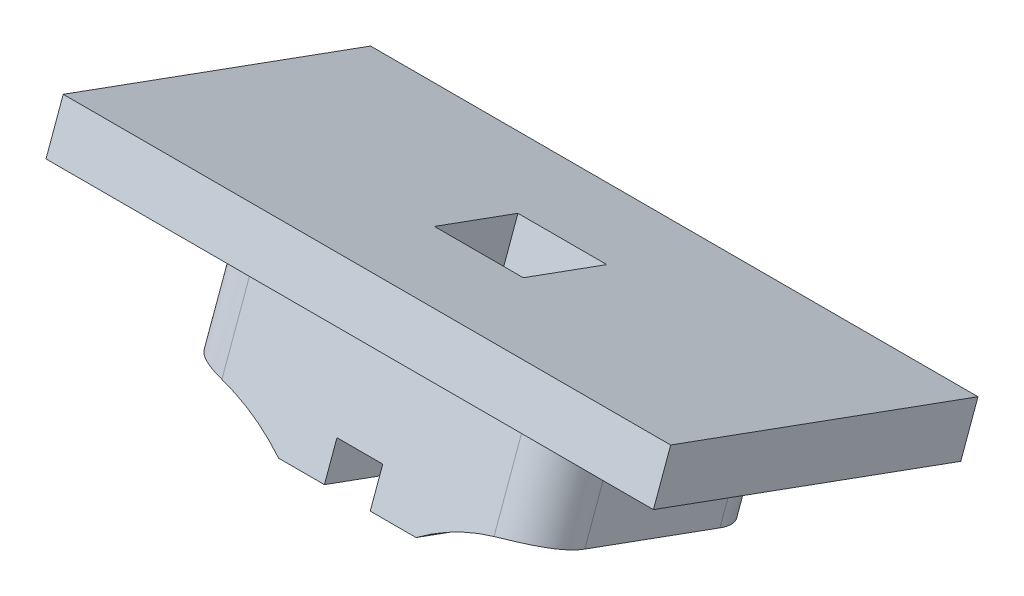
ISO-10303-21;
HEADER;
FILE_DESCRIPTION(('STEP AP214'),'2;1');
FILE_NAME('part.step','',(''),(''),'','','');
FILE_SCHEMA(('AUTOMOTIVE_DESIGN { 1 0 10303 214 1 1 1 1 }'));
ENDSEC;
DATA;
#1=APPLICATION_CONTEXT('core data for automotive mechanical design processes');
#2=APPLICATION_PROTOCOL_DEFINITION('international standard','automotive_design',2000,#1);
#3=PRODUCT_CONTEXT('',#1,'mechanical');
#4=PRODUCT('Part','Part','',(#3));
#5=PRODUCT_RELATED_PRODUCT_CATEGORY('part','',(#4));
#6=PRODUCT_DEFINITION_FORMATION('','',#4);
#7=PRODUCT_DEFINITION_CONTEXT('part definition',#1,'design');
#8=PRODUCT_DEFINITION('design','',#6,#7);
#9=PRODUCT_DEFINITION_SHAPE('','',#8);
#10=(LENGTH_UNIT() NAMED_UNIT(*) SI_UNIT(.MILLI.,.METRE.));
#11=(NAMED_UNIT(*) PLANE_ANGLE_UNIT() SI_UNIT($,.RADIAN.));
#12=(NAMED_UNIT(*) SI_UNIT($,.STERADIAN.) SOLID_ANGLE_UNIT());
#13=UNCERTAINTY_MEASURE_WITH_UNIT(LENGTH_MEASURE(1.E-05),#10,'distance_accuracy_value','');
#14=(GEOMETRIC_REPRESENTATION_CONTEXT(3) GLOBAL_UNCERTAINTY_ASSIGNED_CONTEXT((#13)) GLOBAL_UNIT_ASSIGNED_CONTEXT((#10,
#11,#12)) REPRESENTATION_CONTEXT('',''));
#15=CARTESIAN_POINT('',(0.,0.,0.));
#16=DIRECTION('',(0.,0.,1.));
#17=DIRECTION('',(1.,0.,0.));
#18=AXIS2_PLACEMENT_3D('',#15,#16,#17);
#19=CARTESIAN_POINT('',(-3.95,-154.797534153844,42.6878754649024));
#20=DIRECTION('',(0.,-0.34202014332567,-0.939692620785908));
#21=DIRECTION('',(0.,0.939692620785908,-0.34202014332567));
#22=AXIS2_PLACEMENT_3D('',#19,#20,#21);
#23=PLANE('',#22);
#24=CARTESIAN_POINT('',(2.98999999999996,-147.707143319751,40.1071842519784));
#25=DIRECTION('',(0.,-0.34202014332567,-0.939692620785908));
#26=DIRECTION('',(0.,0.939692620785908,-0.34202014332567));
#27=AXIS2_PLACEMENT_3D('',#24,#25,#26);
#28=CIRCLE('',#27,4.21306249999999);
#29=CARTESIAN_POINT('',(1.98999999999998,-143.861297502622,38.7074108489664));
#30=VERTEX_POINT('',#29);
#31=CARTESIAN_POINT('',(0.520000000000027,-144.49991367422,38.939848126549));
#32=VERTEX_POINT('',#31);
#33=EDGE_CURVE('E63',#30,#32,#28,.F.);
#34=ORIENTED_EDGE('',*,*,#33,.F.);
#35=DIRECTION('',(0.,0.939692620785908,-0.34202014332567));
#36=VECTOR('',#35,1.);
#37=CARTESIAN_POINT('',(1.98999999999998,-154.797534153844,42.6878754649024));
#38=LINE('',#37,#36);
#39=CARTESIAN_POINT('',(1.98999999999999,-141.774805073941,37.9479897109045));
#40=VERTEX_POINT('',#39);
#41=EDGE_CURVE('E368',#30,#40,#38,.T.);
#42=ORIENTED_EDGE('',*,*,#41,.T.);
#43=DIRECTION('',(-1.,0.,0.));
#44=VECTOR('',#43,1.);
#45=CARTESIAN_POINT('',(-3.95,-141.774805073941,37.9479897109045));
#46=LINE('',#45,#44);
#47=CARTESIAN_POINT('',(-3.95,-141.774805073941,37.9479897109045));
#48=VERTEX_POINT('',#47);
#49=EDGE_CURVE('E456',#40,#48,#46,.T.);
#50=ORIENTED_EDGE('',*,*,#49,.T.);
#51=DIRECTION('',(0.,0.939692620785908,-0.34202014332567));
#52=VECTOR('',#51,1.);
#53=CARTESIAN_POINT('',(-3.95,-154.797534153844,42.6878754649024));
#54=LINE('',#53,#52);
#55=CARTESIAN_POINT('',(-3.95,-143.861297502622,38.7074108489664));
#56=VERTEX_POINT('',#55);
#57=EDGE_CURVE('E459',#56,#48,#54,.T.);
#58=ORIENTED_EDGE('',*,*,#57,.F.);
#59=CARTESIAN_POINT('',(-4.94999999999997,-147.707143319751,40.1071842519784));
#60=DIRECTION('',(0.,-0.34202014332567,-0.939692620785908));
#61=DIRECTION('',(0.,0.939692620785908,-0.34202014332567));
#62=AXIS2_PLACEMENT_3D('',#59,#60,#61);
#63=CIRCLE('',#62,4.21306249999999);
#64=CARTESIAN_POINT('',(-2.47999999999998,-144.49991367422,38.9398481265489));
#65=VERTEX_POINT('',#64);
#66=EDGE_CURVE('E297',#56,#65,#63,.T.);
#67=ORIENTED_EDGE('',*,*,#66,.T.);
#68=DIRECTION('',(1.,0.,0.));
#69=VECTOR('',#68,1.);
#70=CARTESIAN_POINT('',(-3.95,-144.49991367422,38.9398481265489));
#71=LINE('',#70,#69);
#72=CARTESIAN_POINT('',(-1.47999999999998,-144.49991367422,38.939848126549));
#73=VERTEX_POINT('',#72);
#74=EDGE_CURVE('E380',#65,#73,#71,.T.);
#75=ORIENTED_EDGE('',*,*,#74,.T.);
#76=DIRECTION('',(0.,0.939692620785908,-0.34202014332567));
#77=VECTOR('',#76,1.);
#78=CARTESIAN_POINT('',(-1.47999999999999,-154.797534153844,42.6878754649024));
#79=LINE('',#78,#77);
#80=CARTESIAN_POINT('',(-1.47999999999998,-143.748159577591,38.6662320118884));
#81=VERTEX_POINT('',#80);
#82=EDGE_CURVE('E430',#73,#81,#79,.T.);
#83=ORIENTED_EDGE('',*,*,#82,.T.);
#84=DIRECTION('',(1.,0.,0.));
#85=VECTOR('',#84,1.);
#86=CARTESIAN_POINT('',(-3.95,-143.748159577591,38.6662320118884));
#87=LINE('',#86,#85);
#88=CARTESIAN_POINT('',(-0.479999999999979,-143.748159577591,38.6662320118884));
#89=VERTEX_POINT('',#88);
#90=EDGE_CURVE('E437',#81,#89,#87,.T.);
#91=ORIENTED_EDGE('',*,*,#90,.T.);
#92=DIRECTION('',(0.,-0.939692620785908,0.34202014332567));
#93=VECTOR('',#92,1.);
#94=CARTESIAN_POINT('',(-0.47999999999998,-154.797534153844,42.6878754649024));
#95=LINE('',#94,#93);
#96=CARTESIAN_POINT('',(-0.479999999999979,-144.49991367422,38.939848126549));
#97=VERTEX_POINT('',#96);
#98=EDGE_CURVE('E296',#89,#97,#95,.T.);
#99=ORIENTED_EDGE('',*,*,#98,.T.);
#100=EDGE_CURVE('E377',#97,#32,#71,.T.);
#101=ORIENTED_EDGE('',*,*,#100,.T.);
#102=EDGE_LOOP('',(#34,#42,#50,#58,#67,#75,#83,#91,#99,#101));
#103=FACE_BOUND('',#102,.T.);
#104=ADVANCED_FACE('F41',(#103),#23,.F.);
#105=CARTESIAN_POINT('',(1.98999999999998,-155.13955429717,41.7481828441164));
#106=DIRECTION('',(0.,0.939692620785908,-0.34202014332567));
#107=DIRECTION('',(0.,0.34202014332567,0.939692620785908));
#108=AXIS2_PLACEMENT_3D('',#105,#106,#107);
#109=CYLINDRICAL_SURFACE('',#108,1.00000000000001);
#110=CARTESIAN_POINT('',(2.98999999999999,-144.090179720917,37.7265393911025));
#111=CARTESIAN_POINT('',(2.98999981089763,-144.080563956813,37.7529632219292));
#112=CARTESIAN_POINT('',(2.98881323349565,-144.070949583094,37.7793732278266));
#113=CARTESIAN_POINT('',(2.98407947173324,-144.051796069825,37.8320069021499));
#114=CARTESIAN_POINT('',(2.98053239500555,-144.042256926866,37.8582305790169));
#115=CARTESIAN_POINT('',(2.96638315016541,-144.013889055484,37.9363069193754));
#116=CARTESIAN_POINT('',(2.95227288035968,-143.995279613466,37.9876478262943));
#117=CARTESIAN_POINT('',(2.91508864291903,-143.9594675264,38.0874969827754));
#118=CARTESIAN_POINT('',(2.89201009605695,-143.942265605475,38.1360037706497));
#119=CARTESIAN_POINT('',(2.83755084831836,-143.910161058753,38.2289469617689));
#120=CARTESIAN_POINT('',(2.80617154510597,-143.895258046537,38.2733840485675));
#121=CARTESIAN_POINT('',(2.73610732829881,-143.868707263668,38.3569925299663));
#122=CARTESIAN_POINT('',(2.69743980668151,-143.857051903917,38.3961760878007));
#123=CARTESIAN_POINT('',(2.61390616137842,-143.837816731237,38.4684701498096));
#124=CARTESIAN_POINT('',(2.56904027416754,-143.83023676288,38.5015808855574));
#125=CARTESIAN_POINT('',(2.47495723246724,-143.819918444837,38.5606941272807));
#126=CARTESIAN_POINT('',(2.42578605235699,-143.817134253494,38.5867619044176));
#127=CARTESIAN_POINT('',(2.32423345518072,-143.816727707154,38.631694006784));
#128=CARTESIAN_POINT('',(2.27185268727983,-143.819104311673,38.6505597831317));
#129=CARTESIAN_POINT('',(2.18098361680716,-143.827703022599,38.6764099235503));
#130=CARTESIAN_POINT('',(2.14288144224999,-143.832606986282,38.6852538315473));
#131=CARTESIAN_POINT('',(2.06647677901283,-143.845018076573,38.6991585058553));
#132=CARTESIAN_POINT('',(2.02817472137312,-143.852520920438,38.7042254532572));
#133=CARTESIAN_POINT('',(1.98999999999998,-143.861297502622,38.7074108489664));
#134=B_SPLINE_CURVE_WITH_KNOTS('',3,(#110,#111,#112,#113,#114,#115,#116,#117,#118,#119,#120,
#121,#122,#123,#124,#125,#126,#127,#128,#129,#130,#131,#132,#133),.UNSPECIFIED.,.F.,.F.,(4,2,2,
2,2,2,2,2,2,2,2,4),(0.,0.0843054131839658,0.168606982519982,0.336948632178147,0.505376350731921,
0.673775727807584,0.841778225334614,1.00977431513838,1.17615547140109,1.34250308610158,
1.46051200876004,1.57832738027524),.UNSPECIFIED.);
#135=CARTESIAN_POINT('',(2.98999999999996,-144.090179720917,37.7265393911025));
#136=VERTEX_POINT('',#135);
#137=EDGE_CURVE('E238',#136,#30,#134,.T.);
#138=ORIENTED_EDGE('',*,*,#137,.F.);
#139=DIRECTION('',(0.,0.939692620785908,-0.34202014332567));
#140=VECTOR('',#139,1.);
#141=CARTESIAN_POINT('',(2.98999999999998,-155.13955429717,41.7481828441164));
#142=LINE('',#141,#140);
#143=CARTESIAN_POINT('',(2.98999999999999,-142.116825217266,37.0082970901186));
#144=VERTEX_POINT('',#143);
#145=EDGE_CURVE('E357',#136,#144,#142,.T.);
#146=ORIENTED_EDGE('',*,*,#145,.T.);
#147=CARTESIAN_POINT('',(1.98999999999999,-142.116825217266,37.0082970901186));
#148=DIRECTION('',(0.,-0.939692620785908,0.34202014332567));
#149=DIRECTION('',(0.,-0.34202014332567,-0.939692620785908));
#150=AXIS2_PLACEMENT_3D('',#147,#148,#149);
#151=CIRCLE('',#150,1.00000000000001);
#152=EDGE_CURVE('E453',#144,#40,#151,.T.);
#153=ORIENTED_EDGE('',*,*,#152,.T.);
#154=ORIENTED_EDGE('',*,*,#41,.F.);
#155=EDGE_LOOP('',(#138,#146,#153,#154));
#156=FACE_BOUND('',#155,.T.);
#157=ADVANCED_FACE('F336',(#156),#109,.T.);
#158=CARTESIAN_POINT('',(2.98999999999998,-155.13955429717,41.7481828441164));
#159=DIRECTION('',(-1.,0.,0.));
#160=DIRECTION('',(0.,0.,1.));
#161=AXIS2_PLACEMENT_3D('',#158,#159,#160);
#162=PLANE('',#161);
#163=DIRECTION('',(0.,-0.34202014332567,-0.939692620785908));
#164=VECTOR('',#163,1.);
#165=CARTESIAN_POINT('',(2.98999999999996,-143.268458200257,39.984200714195));
#166=LINE('',#165,#164);
#167=CARTESIAN_POINT('',(2.98999999999996,-145.164122970959,34.7759045618348));
#168=VERTEX_POINT('',#167);
#169=EDGE_CURVE('E227',#136,#168,#166,.T.);
#170=ORIENTED_EDGE('',*,*,#169,.T.);
#171=DIRECTION('',(0.,0.939692620785908,-0.34202014332567));
#172=VECTOR('',#171,1.);
#173=CARTESIAN_POINT('',(2.98999999999998,-156.213497547213,38.7975480148487));
#174=LINE('',#173,#172);
#175=CARTESIAN_POINT('',(2.98999999999998,-143.190768467309,34.0576622608509));
#176=VERTEX_POINT('',#175);
#177=EDGE_CURVE('E355',#168,#176,#174,.T.);
#178=ORIENTED_EDGE('',*,*,#177,.T.);
#179=DIRECTION('',(0.,0.342020143325669,0.939692620785908));
#180=VECTOR('',#179,1.);
#181=CARTESIAN_POINT('',(2.98999999999999,-142.116825217266,37.0082970901186));
#182=LINE('',#181,#180);
#183=EDGE_CURVE('E451',#176,#144,#182,.T.);
#184=ORIENTED_EDGE('',*,*,#183,.T.);
#185=ORIENTED_EDGE('',*,*,#145,.F.);
#186=EDGE_LOOP('',(#170,#178,#184,#185));
#187=FACE_BOUND('',#186,.T.);
#188=ADVANCED_FACE('F342',(#187),#162,.F.);
#189=CARTESIAN_POINT('',(1.98999999999998,-156.213497547213,38.7975480148487));
#190=DIRECTION('',(0.,0.939692620785908,-0.34202014332567));
#191=DIRECTION('',(0.,0.34202014332567,0.939692620785908));
#192=AXIS2_PLACEMENT_3D('',#189,#190,#191);
#193=CYLINDRICAL_SURFACE('',#192,0.999999999999998);
#194=CARTESIAN_POINT('',(1.98999999999998,-145.619281039316,33.8773907781269));
#195=CARTESIAN_POINT('',(2.01725761619235,-145.613021162079,33.8751125558203));
#196=CARTESIAN_POINT('',(2.04457165974822,-145.606641215649,33.8739771819487));
#197=CARTESIAN_POINT('',(2.09914786208943,-145.593657121647,33.8740205749128));
#198=CARTESIAN_POINT('',(2.12641001370607,-145.587052945179,33.8751996411176));
#199=CARTESIAN_POINT('',(2.20779213863846,-145.5669474309,33.8822456760713));
#200=CARTESIAN_POINT('',(2.26157759848619,-145.553137184371,33.891615579739));
#201=CARTESIAN_POINT('',(2.36656171501323,-145.524802057621,33.9195645312937));
#202=CARTESIAN_POINT('',(2.41775676991292,-145.510276234947,33.9381560333431));
#203=CARTESIAN_POINT('',(2.51588163335732,-145.48053008724,33.9839778573471));
#204=CARTESIAN_POINT('',(2.5628134242521,-145.465310089984,34.0112041375417));
#205=CARTESIAN_POINT('',(2.65032210904978,-145.434342058573,34.072921390214));
#206=CARTESIAN_POINT('',(2.69098110698206,-145.418604847099,34.1073015817504));
#207=CARTESIAN_POINT('',(2.76556409393619,-145.386321415945,34.1824239410087));
#208=CARTESIAN_POINT('',(2.79948603270636,-145.369774951892,34.2231680387043));
#209=CARTESIAN_POINT('',(2.85979047210981,-145.335742587899,34.3099487996764));
#210=CARTESIAN_POINT('',(2.88612610089256,-145.318251608469,34.3560160016736));
#211=CARTESIAN_POINT('',(2.9302316499596,-145.28248122784,34.4517879934917));
#212=CARTESIAN_POINT('',(2.94800541111419,-145.264202184186,34.5014911406724));
#213=CARTESIAN_POINT('',(2.97079683236867,-145.232255191553,34.5888085213347));
#214=CARTESIAN_POINT('',(2.97799094083283,-145.21872562842,34.6259209579902));
#215=CARTESIAN_POINT('',(2.98759387073146,-145.191511886068,34.7006542165697));
#216=CARTESIAN_POINT('',(2.99000824305151,-145.177827904784,34.7382743976274));
#217=CARTESIAN_POINT('',(2.98999999999998,-145.164122970959,34.7759045618348));
#218=B_SPLINE_CURVE_WITH_KNOTS('',3,(#194,#195,#196,#197,#198,#199,#200,#201,#202,#203,#204,
#205,#206,#207,#208,#209,#210,#211,#212,#213,#214,#215,#216,#217),.UNSPECIFIED.,.F.,.F.,(4,2,2,
2,2,2,2,2,2,2,2,4),(0.,0.0841323298433702,0.168275542794124,0.336349102403098,0.50465027312457,
0.672872781548959,0.838661942125925,1.00450147934269,1.17134469250186,1.33811298961133,
1.45829265842672,1.57833267605109),.UNSPECIFIED.);
#219=CARTESIAN_POINT('',(1.98999999999998,-145.619281039316,33.8773907781269));
#220=VERTEX_POINT('',#219);
#221=EDGE_CURVE('E230',#220,#168,#218,.T.);
#222=ORIENTED_EDGE('',*,*,#221,.F.);
#223=DIRECTION('',(0.,0.939692620785908,-0.34202014332567));
#224=VECTOR('',#223,1.);
#225=CARTESIAN_POINT('',(1.98999999999998,-156.555517690538,37.8578553940628));
#226=LINE('',#225,#224);
#227=CARTESIAN_POINT('',(1.98999999999999,-143.532788610635,33.117969640065));
#228=VERTEX_POINT('',#227);
#229=EDGE_CURVE('E364',#220,#228,#226,.T.);
#230=ORIENTED_EDGE('',*,*,#229,.T.);
#231=CARTESIAN_POINT('',(1.98999999999999,-143.190768467309,34.0576622608509));
#232=DIRECTION('',(0.,-0.939692620785908,0.34202014332567));
#233=DIRECTION('',(0.,-0.34202014332567,-0.939692620785908));
#234=AXIS2_PLACEMENT_3D('',#231,#232,#233);
#235=CIRCLE('',#234,0.999999999999998);
#236=EDGE_CURVE('E362',#228,#176,#235,.T.);
#237=ORIENTED_EDGE('',*,*,#236,.T.);
#238=ORIENTED_EDGE('',*,*,#177,.F.);
#239=EDGE_LOOP('',(#222,#230,#237,#238));
#240=FACE_BOUND('',#239,.T.);
#241=ADVANCED_FACE('F245',(#240),#193,.T.);
#242=CARTESIAN_POINT('',(-3.95,-156.555517690538,37.8578553940628));
#243=DIRECTION('',(0.,0.34202014332567,0.939692620785908));
#244=DIRECTION('',(0.,-0.939692620785908,0.34202014332567));
#245=AXIS2_PLACEMENT_3D('',#242,#243,#244);
#246=PLANE('',#245);
#247=CARTESIAN_POINT('',(2.98999999999996,-149.465126856445,35.2771641811389));
#248=DIRECTION('',(0.,0.34202014332567,0.939692620785908));
#249=DIRECTION('',(0.,0.939692620785908,-0.34202014332567));
#250=AXIS2_PLACEMENT_3D('',#247,#248,#249);
#251=CIRCLE('',#250,4.21306249999999);
#252=CARTESIAN_POINT('',(0.519999999999967,-146.257897210914,34.1098280557094));
#253=VERTEX_POINT('',#252);
#254=EDGE_CURVE('E223',#220,#253,#251,.T.);
#255=ORIENTED_EDGE('',*,*,#254,.T.);
#256=DIRECTION('',(-1.,0.,0.));
#257=VECTOR('',#256,1.);
#258=CARTESIAN_POINT('',(-3.95,-146.257897210914,34.1098280557094));
#259=LINE('',#258,#257);
#260=CARTESIAN_POINT('',(-0.47999999999998,-146.257897210914,34.1098280557094));
#261=VERTEX_POINT('',#260);
#262=EDGE_CURVE('E414',#253,#261,#259,.T.);
#263=ORIENTED_EDGE('',*,*,#262,.T.);
#264=DIRECTION('',(0.,-0.939692620785904,0.342020143325681));
#265=VECTOR('',#264,1.);
#266=CARTESIAN_POINT('',(-0.479999999999979,-146.257897210914,34.1098280557094));
#267=LINE('',#266,#265);
#268=CARTESIAN_POINT('',(-0.479999999999979,-145.506143114285,33.8362119410489));
#269=VERTEX_POINT('',#268);
#270=EDGE_CURVE('E477',#269,#261,#267,.T.);
#271=ORIENTED_EDGE('',*,*,#270,.F.);
#272=DIRECTION('',(1.,0.,0.));
#273=VECTOR('',#272,1.);
#274=CARTESIAN_POINT('',(-1.47999999999998,-145.506143114285,33.8362119410489));
#275=LINE('',#274,#273);
#276=CARTESIAN_POINT('',(-1.47999999999998,-145.506143114285,33.8362119410489));
#277=VERTEX_POINT('',#276);
#278=EDGE_CURVE('E485',#277,#269,#275,.T.);
#279=ORIENTED_EDGE('',*,*,#278,.F.);
#280=DIRECTION('',(0.,0.939692620785904,-0.342020143325681));
#281=VECTOR('',#280,1.);
#282=CARTESIAN_POINT('',(-1.47999999999998,-146.257897210914,34.1098280557094));
#283=LINE('',#282,#281);
#284=CARTESIAN_POINT('',(-1.47999999999998,-146.257897210914,34.1098280557094));
#285=VERTEX_POINT('',#284);
#286=EDGE_CURVE('E484',#285,#277,#283,.T.);
#287=ORIENTED_EDGE('',*,*,#286,.F.);
#288=CARTESIAN_POINT('',(-2.47999999999998,-146.257897210914,34.1098280557094));
#289=VERTEX_POINT('',#288);
#290=EDGE_CURVE('E424',#285,#289,#259,.T.);
#291=ORIENTED_EDGE('',*,*,#290,.T.);
#292=CARTESIAN_POINT('',(-4.94999999999997,-149.465126856445,35.2771641811389));
#293=DIRECTION('',(0.,-0.34202014332567,-0.939692620785908));
#294=DIRECTION('',(0.,0.939692620785908,-0.34202014332567));
#295=AXIS2_PLACEMENT_3D('',#292,#293,#294);
#296=CIRCLE('',#295,4.21306249999999);
#297=CARTESIAN_POINT('',(-3.95,-145.619281039316,33.8773907781269));
#298=VERTEX_POINT('',#297);
#299=EDGE_CURVE('E483',#298,#289,#296,.T.);
#300=ORIENTED_EDGE('',*,*,#299,.F.);
#301=DIRECTION('',(0.,0.939692620785908,-0.34202014332567));
#302=VECTOR('',#301,1.);
#303=CARTESIAN_POINT('',(-3.95,-156.555517690538,37.8578553940628));
#304=LINE('',#303,#302);
#305=CARTESIAN_POINT('',(-3.95,-143.532788610635,33.117969640065));
#306=VERTEX_POINT('',#305);
#307=EDGE_CURVE('E366',#298,#306,#304,.T.);
#308=ORIENTED_EDGE('',*,*,#307,.T.);
#309=DIRECTION('',(1.,0.,0.));
#310=VECTOR('',#309,1.);
#311=CARTESIAN_POINT('',(-3.95,-143.532788610635,33.117969640065));
#312=LINE('',#311,#310);
#313=EDGE_CURVE('E447',#306,#228,#312,.T.);
#314=ORIENTED_EDGE('',*,*,#313,.T.);
#315=ORIENTED_EDGE('',*,*,#229,.F.);
#316=EDGE_LOOP('',(#255,#263,#271,#279,#287,#291,#300,#308,#314,#315));
#317=FACE_BOUND('',#316,.T.);
#318=ADVANCED_FACE('F305',(#317),#246,.F.);
#319=CARTESIAN_POINT('',(22.9,-148.371581696666,28.3025276592525));
#320=DIRECTION('',(0.,0.939692620785908,-0.342020143325668));
#321=DIRECTION('',(0.,0.342020143325668,0.939692620785909));
#322=AXIS2_PLACEMENT_3D('',#319,#320,#321);
#323=PLANE('',#322);
#324=DIRECTION('',(0.,-0.34202014332567,-0.939692620785908));
#325=VECTOR('',#324,1.);
#326=CARTESIAN_POINT('',(0.520000000000025,-144.020212296886,40.2578168288555));
#327=LINE('',#326,#325);
#328=EDGE_CURVE('E12',#32,#253,#327,.T.);
#329=ORIENTED_EDGE('',*,*,#328,.F.);
#330=ORIENTED_EDGE('',*,*,#100,.F.);
#331=DIRECTION('',(0.,-0.342020143325668,-0.939692620785909));
#332=VECTOR('',#331,1.);
#333=CARTESIAN_POINT('',(-0.47999999999998,-148.371581696666,28.3025276592525));
#334=LINE('',#333,#332);
#335=EDGE_CURVE('E417',#97,#261,#334,.T.);
#336=ORIENTED_EDGE('',*,*,#335,.T.);
#337=ORIENTED_EDGE('',*,*,#262,.F.);
#338=EDGE_LOOP('',(#329,#330,#336,#337));
#339=FACE_BOUND('',#338,.T.);
#340=ADVANCED_FACE('F275',(#339),#323,.F.);
#341=ORIENTED_EDGE('',*,*,#290,.F.);
#342=DIRECTION('',(0.,0.342020143325668,0.939692620785909));
#343=VECTOR('',#342,1.);
#344=CARTESIAN_POINT('',(-1.47999999999998,-148.371581696666,28.3025276592525));
#345=LINE('',#344,#343);
#346=EDGE_CURVE('E49',#285,#73,#345,.T.);
#347=ORIENTED_EDGE('',*,*,#346,.T.);
#348=ORIENTED_EDGE('',*,*,#74,.F.);
#349=DIRECTION('',(0.,-0.34202014332567,-0.939692620785908));
#350=VECTOR('',#349,1.);
#351=CARTESIAN_POINT('',(-2.47999999999982,-118.27897116032,110.981295600306));
#352=LINE('',#351,#350);
#353=EDGE_CURVE('E401',#65,#289,#352,.T.);
#354=ORIENTED_EDGE('',*,*,#353,.T.);
#355=EDGE_LOOP('',(#341,#347,#348,#354));
#356=FACE_BOUND('',#355,.T.);
#357=ADVANCED_FACE('F327',(#356),#323,.F.);
#358=CARTESIAN_POINT('',(5.65,-158.214630460567,37.3975452851682));
#359=DIRECTION('',(-1.,0.,0.));
#360=DIRECTION('',(0.,0.,1.));
#361=AXIS2_PLACEMENT_3D('',#358,#359,#360);
#362=PLANE('',#361);
#363=DIRECTION('',(0.,0.34202014332567,0.939692620785908));
#364=VECTOR('',#363,1.);
#365=CARTESIAN_POINT('',(5.65,-143.87480875396,32.1782770192791));
#366=LINE('',#365,#364);
#367=CARTESIAN_POINT('',(5.65,-143.87480875396,32.1782770192791));
#368=VERTEX_POINT('',#367);
#369=CARTESIAN_POINT('',(5.65,-141.432784930615,38.8876823316904));
#370=VERTEX_POINT('',#369);
#371=EDGE_CURVE('E405',#368,#370,#366,.T.);
#372=ORIENTED_EDGE('',*,*,#371,.F.);
#373=DIRECTION('',(0.,0.939692620785908,-0.342020143325669));
#374=VECTOR('',#373,1.);
#375=CARTESIAN_POINT('',(5.65,-158.214630460567,37.3975452851682));
#376=LINE('',#375,#374);
#377=CARTESIAN_POINT('',(5.65,-142.841146871096,31.8020548616209));
#378=VERTEX_POINT('',#377);
#379=EDGE_CURVE('E397',#368,#378,#376,.T.);
#380=ORIENTED_EDGE('',*,*,#379,.T.);
#381=DIRECTION('',(0.,0.342020143325666,0.939692620785909));
#382=VECTOR('',#381,1.);
#383=CARTESIAN_POINT('',(5.65,-142.841146871096,31.8020548616209));
#384=LINE('',#383,#382);
#385=CARTESIAN_POINT('',(5.65,-140.399123047751,38.5114601740322));
#386=VERTEX_POINT('',#385);
#387=EDGE_CURVE('E394',#378,#386,#384,.T.);
#388=ORIENTED_EDGE('',*,*,#387,.T.);
#389=DIRECTION('',(0.,0.939692620785908,-0.342020143325669));
#390=VECTOR('',#389,1.);
#391=CARTESIAN_POINT('',(5.65,-155.772606637221,44.1069505975795));
#392=LINE('',#391,#390);
#393=EDGE_CURVE('E393',#370,#386,#392,.T.);
#394=ORIENTED_EDGE('',*,*,#393,.F.);
#395=EDGE_LOOP('',(#372,#380,#388,#394));
#396=FACE_BOUND('',#395,.T.);
#397=ADVANCED_FACE('F324',(#396),#362,.F.);
#398=CARTESIAN_POINT('',(5.65,-155.772606637221,44.1069505975795));
#399=DIRECTION('',(0.,-0.342020143325669,-0.939692620785908));
#400=DIRECTION('',(0.,0.939692620785908,-0.342020143325669));
#401=AXIS2_PLACEMENT_3D('',#398,#399,#400);
#402=PLANE('',#401);
#403=DIRECTION('',(-1.,0.,0.));
#404=VECTOR('',#403,1.);
#405=CARTESIAN_POINT('',(5.65,-141.432784930615,38.8876823316904));
#406=LINE('',#405,#404);
#407=CARTESIAN_POINT('',(-7.61,-141.432784930615,38.8876823316904));
#408=VERTEX_POINT('',#407);
#409=EDGE_CURVE('E402',#370,#408,#406,.T.);
#410=ORIENTED_EDGE('',*,*,#409,.F.);
#411=ORIENTED_EDGE('',*,*,#393,.T.);
#412=DIRECTION('',(-1.,0.,0.));
#413=VECTOR('',#412,1.);
#414=CARTESIAN_POINT('',(5.65,-140.399123047751,38.5114601740322));
#415=LINE('',#414,#413);
#416=CARTESIAN_POINT('',(-7.61,-140.399123047751,38.5114601740322));
#417=VERTEX_POINT('',#416);
#418=EDGE_CURVE('E390',#386,#417,#415,.T.);
#419=ORIENTED_EDGE('',*,*,#418,.T.);
#420=DIRECTION('',(0.,0.939692620785908,-0.342020143325669));
#421=VECTOR('',#420,1.);
#422=CARTESIAN_POINT('',(-7.61,-155.772606637221,44.1069505975795));
#423=LINE('',#422,#421);
#424=EDGE_CURVE('E389',#408,#417,#423,.T.);
#425=ORIENTED_EDGE('',*,*,#424,.F.);
#426=EDGE_LOOP('',(#410,#411,#419,#425));
#427=FACE_BOUND('',#426,.T.);
#428=ADVANCED_FACE('F321',(#427),#402,.F.);
#429=CARTESIAN_POINT('',(-7.61,-158.214630460567,37.3975452851682));
#430=DIRECTION('',(1.,0.,0.));
#431=DIRECTION('',(0.,0.,-1.));
#432=AXIS2_PLACEMENT_3D('',#429,#430,#431);
#433=PLANE('',#432);
#434=DIRECTION('',(0.,-0.34202014332567,-0.939692620785908));
#435=VECTOR('',#434,1.);
#436=CARTESIAN_POINT('',(-7.61,-143.87480875396,32.1782770192791));
#437=LINE('',#436,#435);
#438=CARTESIAN_POINT('',(-7.61,-143.87480875396,32.1782770192791));
#439=VERTEX_POINT('',#438);
#440=EDGE_CURVE('E398',#408,#439,#437,.T.);
#441=ORIENTED_EDGE('',*,*,#440,.F.);
#442=ORIENTED_EDGE('',*,*,#424,.T.);
#443=DIRECTION('',(0.,-0.342020143325667,-0.939692620785909));
#444=VECTOR('',#443,1.);
#445=CARTESIAN_POINT('',(-7.61,-142.841146871096,31.8020548616209));
#446=LINE('',#445,#444);
#447=CARTESIAN_POINT('',(-7.61,-142.841146871096,31.8020548616209));
#448=VERTEX_POINT('',#447);
#449=EDGE_CURVE('E386',#417,#448,#446,.T.);
#450=ORIENTED_EDGE('',*,*,#449,.T.);
#451=DIRECTION('',(0.,0.939692620785908,-0.342020143325669));
#452=VECTOR('',#451,1.);
#453=CARTESIAN_POINT('',(-7.61,-158.214630460567,37.3975452851682));
#454=LINE('',#453,#452);
#455=EDGE_CURVE('E385',#439,#448,#454,.T.);
#456=ORIENTED_EDGE('',*,*,#455,.F.);
#457=EDGE_LOOP('',(#441,#442,#450,#456));
#458=FACE_BOUND('',#457,.T.);
#459=ADVANCED_FACE('F317',(#458),#433,.F.);
#460=CARTESIAN_POINT('',(5.65,-158.214630460567,37.3975452851682));
#461=DIRECTION('',(0.,0.342020143325669,0.939692620785908));
#462=DIRECTION('',(0.,-0.939692620785908,0.342020143325669));
#463=AXIS2_PLACEMENT_3D('',#460,#461,#462);
#464=PLANE('',#463);
#465=DIRECTION('',(1.,0.,0.));
#466=VECTOR('',#465,1.);
#467=CARTESIAN_POINT('',(5.65,-143.87480875396,32.1782770192791));
#468=LINE('',#467,#466);
#469=EDGE_CURVE('E384',#439,#368,#468,.T.);
#470=ORIENTED_EDGE('',*,*,#469,.F.);
#471=ORIENTED_EDGE('',*,*,#455,.T.);
#472=DIRECTION('',(1.,0.,0.));
#473=VECTOR('',#472,1.);
#474=CARTESIAN_POINT('',(5.65,-142.841146871096,31.8020548616209));
#475=LINE('',#474,#473);
#476=EDGE_CURVE('E381',#448,#378,#475,.T.);
#477=ORIENTED_EDGE('',*,*,#476,.T.);
#478=ORIENTED_EDGE('',*,*,#379,.F.);
#479=EDGE_LOOP('',(#470,#471,#477,#478));
#480=FACE_BOUND('',#479,.T.);
#481=ADVANCED_FACE('F314',(#480),#464,.F.);
#482=CARTESIAN_POINT('',(0.,-136.352890254031,49.6283934086332));
#483=DIRECTION('',(0.,-0.939692620785909,0.342020143325667));
#484=DIRECTION('',(0.,-0.342020143325667,-0.939692620785909));
#485=AXIS2_PLACEMENT_3D('',#482,#483,#484);
#486=PLANE('',#485);
#487=DIRECTION('',(1.,0.,0.));
#488=VECTOR('',#487,1.);
#489=CARTESIAN_POINT('',(-1.94999999999999,-141.288375420397,36.0682593599889));
#490=LINE('',#489,#488);
#491=CARTESIAN_POINT('',(-1.94999999999999,-141.288375420397,36.0682593599889));
#492=VERTEX_POINT('',#491);
#493=CARTESIAN_POINT('',(-0.0100000000000198,-141.288375420397,36.0682593599889));
#494=VERTEX_POINT('',#493);
#495=EDGE_CURVE('E205',#492,#494,#490,.T.);
#496=ORIENTED_EDGE('',*,*,#495,.F.);
#497=DIRECTION('',(0.,0.342020143325668,0.939692620785909));
#498=VECTOR('',#497,1.);
#499=CARTESIAN_POINT('',(-1.94999999999999,-141.288375420397,36.0682593599889));
#500=LINE('',#499,#498);
#501=CARTESIAN_POINT('',(-1.95,-141.951894498449,34.2452556756642));
#502=VERTEX_POINT('',#501);
#503=EDGE_CURVE('E56',#502,#492,#500,.T.);
#504=ORIENTED_EDGE('',*,*,#503,.F.);
#505=DIRECTION('',(-1.,0.,0.));
#506=VECTOR('',#505,1.);
#507=CARTESIAN_POINT('',(-1.95,-141.951894498449,34.2452556756642));
#508=LINE('',#507,#506);
#509=CARTESIAN_POINT('',(-0.0100000000000198,-141.951894498449,34.2452556756642));
#510=VERTEX_POINT('',#509);
#511=EDGE_CURVE('E212',#510,#502,#508,.T.);
#512=ORIENTED_EDGE('',*,*,#511,.F.);
#513=DIRECTION('',(0.,-0.342020143325668,-0.939692620785909));
#514=VECTOR('',#513,1.);
#515=CARTESIAN_POINT('',(-0.0100000000000198,-141.288375420397,36.0682593599889));
#516=LINE('',#515,#514);
#517=EDGE_CURVE('E195',#494,#510,#516,.T.);
#518=ORIENTED_EDGE('',*,*,#517,.F.);
#519=EDGE_LOOP('',(#496,#504,#512,#518));
#520=FACE_BOUND('',#519,.T.);
#521=ORIENTED_EDGE('',*,*,#387,.F.);
#522=ORIENTED_EDGE('',*,*,#476,.F.);
#523=ORIENTED_EDGE('',*,*,#449,.F.);
#524=ORIENTED_EDGE('',*,*,#418,.F.);
#525=EDGE_LOOP('',(#521,#522,#523,#524));
#526=FACE_BOUND('',#525,.T.);
#527=ADVANCED_FACE('F209',(#520,#526),#486,.F.);
#528=CARTESIAN_POINT('',(0.,-137.386552136895,50.0046155662918));
#529=DIRECTION('',(0.,-0.939692620785908,0.34202014332567));
#530=DIRECTION('',(0.,-0.34202014332567,-0.939692620785908));
#531=AXIS2_PLACEMENT_3D('',#528,#529,#530);
#532=PLANE('',#531);
#533=CARTESIAN_POINT('',(-3.95,-142.116825217266,37.0082970901186));
#534=DIRECTION('',(0.,-0.939692620785908,0.34202014332567));
#535=DIRECTION('',(0.,-0.34202014332567,-0.939692620785908));
#536=AXIS2_PLACEMENT_3D('',#533,#534,#535);
#537=CIRCLE('',#536,0.999999999999997);
#538=CARTESIAN_POINT('',(-4.95,-142.116825217266,37.0082970901186));
#539=VERTEX_POINT('',#538);
#540=EDGE_CURVE('E438',#48,#539,#537,.T.);
#541=ORIENTED_EDGE('',*,*,#540,.F.);
#542=ORIENTED_EDGE('',*,*,#49,.F.);
#543=ORIENTED_EDGE('',*,*,#152,.F.);
#544=ORIENTED_EDGE('',*,*,#183,.F.);
#545=ORIENTED_EDGE('',*,*,#236,.F.);
#546=ORIENTED_EDGE('',*,*,#313,.F.);
#547=CARTESIAN_POINT('',(-3.95,-143.190768467309,34.0576622608509));
#548=DIRECTION('',(0.,-0.939692620785908,0.34202014332567));
#549=DIRECTION('',(0.,-0.34202014332567,-0.939692620785908));
#550=AXIS2_PLACEMENT_3D('',#547,#548,#549);
#551=CIRCLE('',#550,0.999999999999997);
#552=CARTESIAN_POINT('',(-4.95,-143.190768467309,34.0576622608509));
#553=VERTEX_POINT('',#552);
#554=EDGE_CURVE('E444',#553,#306,#551,.T.);
#555=ORIENTED_EDGE('',*,*,#554,.F.);
#556=DIRECTION('',(0.,-0.342020143325677,-0.939692620785905));
#557=VECTOR('',#556,1.);
#558=CARTESIAN_POINT('',(-4.95,-142.116825217266,37.0082970901186));
#559=LINE('',#558,#557);
#560=EDGE_CURVE('E441',#539,#553,#559,.T.);
#561=ORIENTED_EDGE('',*,*,#560,.F.);
#562=EDGE_LOOP('',(#541,#542,#543,#544,#545,#546,#555,#561));
#563=FACE_BOUND('',#562,.T.);
#564=ORIENTED_EDGE('',*,*,#469,.T.);
#565=ORIENTED_EDGE('',*,*,#371,.T.);
#566=ORIENTED_EDGE('',*,*,#409,.T.);
#567=ORIENTED_EDGE('',*,*,#440,.T.);
#568=EDGE_LOOP('',(#564,#565,#566,#567));
#569=FACE_BOUND('',#568,.T.);
#570=ADVANCED_FACE('F43',(#563,#569),#532,.T.);
#571=CARTESIAN_POINT('',(-3.95,-156.213497547213,38.7975480148487));
#572=DIRECTION('',(0.,0.939692620785908,-0.34202014332567));
#573=DIRECTION('',(0.,0.34202014332567,0.939692620785908));
#574=AXIS2_PLACEMENT_3D('',#571,#572,#573);
#575=CYLINDRICAL_SURFACE('',#574,0.999999999999997);
#576=ORIENTED_EDGE('',*,*,#307,.F.);
#577=CARTESIAN_POINT('',(-3.95,-145.619281039316,33.8773907781269));
#578=CARTESIAN_POINT('',(-3.97725761619236,-145.613021162079,33.8751125558203));
#579=CARTESIAN_POINT('',(-4.00457165974823,-145.606641215649,33.8739771819487));
#580=CARTESIAN_POINT('',(-4.05914786208945,-145.593657121647,33.8740205749128));
#581=CARTESIAN_POINT('',(-4.08641001370609,-145.587052945179,33.8751996411176));
#582=CARTESIAN_POINT('',(-4.16779213863847,-145.5669474309,33.8822456760713));
#583=CARTESIAN_POINT('',(-4.2215775984862,-145.553137184371,33.891615579739));
#584=CARTESIAN_POINT('',(-4.32656171501324,-145.524802057621,33.9195645312937));
#585=CARTESIAN_POINT('',(-4.37775676991293,-145.510276234947,33.9381560333431));
#586=CARTESIAN_POINT('',(-4.47588163335732,-145.48053008724,33.9839778573471));
#587=CARTESIAN_POINT('',(-4.5228134242521,-145.465310089984,34.0112041375417));
#588=CARTESIAN_POINT('',(-4.61032210904978,-145.434342058573,34.072921390214));
#589=CARTESIAN_POINT('',(-4.65098110698207,-145.418604847099,34.1073015817504));
#590=CARTESIAN_POINT('',(-4.7255640939362,-145.386321415945,34.1824239410087));
#591=CARTESIAN_POINT('',(-4.75948603270637,-145.369774951892,34.2231680387043));
#592=CARTESIAN_POINT('',(-4.81979047210981,-145.335742587899,34.3099487996763));
#593=CARTESIAN_POINT('',(-4.84612610089257,-145.318251608469,34.3560160016736));
#594=CARTESIAN_POINT('',(-4.8902316499596,-145.28248122784,34.4517879934917));
#595=CARTESIAN_POINT('',(-4.9080054111142,-145.264202184186,34.5014911406724));
#596=CARTESIAN_POINT('',(-4.93079683236868,-145.232255191553,34.5888085213347));
#597=CARTESIAN_POINT('',(-4.93799094083284,-145.21872562842,34.6259209579902));
#598=CARTESIAN_POINT('',(-4.94759387073147,-145.191511886068,34.7006542165697));
#599=CARTESIAN_POINT('',(-4.95000824305152,-145.177827904784,34.7382743976274));
#600=CARTESIAN_POINT('',(-4.95,-145.164122970959,34.7759045618348));
#601=B_SPLINE_CURVE_WITH_KNOTS('',3,(#577,#578,#579,#580,#581,#582,#583,#584,#585,#586,#587,
#588,#589,#590,#591,#592,#593,#594,#595,#596,#597,#598,#599,#600),.UNSPECIFIED.,.F.,.F.,(4,2,2,
2,2,2,2,2,2,2,2,4),(0.,0.084132329843369,0.168275542794121,0.336349102403091,0.504650273124561,
0.672872781548946,0.838661942125907,1.00450147934267,1.17134469250184,1.33811298961132,
1.4582926584267,1.57833267605108),.UNSPECIFIED.);
#602=CARTESIAN_POINT('',(-4.94999999999997,-145.164122970959,34.7759045618348));
#603=VERTEX_POINT('',#602);
#604=EDGE_CURVE('E288',#298,#603,#601,.T.);
#605=ORIENTED_EDGE('',*,*,#604,.T.);
#606=DIRECTION('',(0.,0.939692620785908,-0.34202014332567));
#607=VECTOR('',#606,1.);
#608=CARTESIAN_POINT('',(-4.95,-156.213497547213,38.7975480148487));
#609=LINE('',#608,#607);
#610=EDGE_CURVE('E373',#603,#553,#609,.T.);
#611=ORIENTED_EDGE('',*,*,#610,.T.);
#612=ORIENTED_EDGE('',*,*,#554,.T.);
#613=EDGE_LOOP('',(#576,#605,#611,#612));
#614=FACE_BOUND('',#613,.T.);
#615=ADVANCED_FACE('F299',(#614),#575,.T.);
#616=CARTESIAN_POINT('',(-4.95,-155.13955429717,41.7481828441164));
#617=DIRECTION('',(1.,0.,0.));
#618=DIRECTION('',(0.,1.,0.));
#619=AXIS2_PLACEMENT_3D('',#616,#617,#618);
#620=PLANE('',#619);
#621=ORIENTED_EDGE('',*,*,#610,.F.);
#622=DIRECTION('',(0.,-0.34202014332567,-0.939692620785908));
#623=VECTOR('',#622,1.);
#624=CARTESIAN_POINT('',(-4.94999999999997,-117.527217063691,110.707679485645));
#625=LINE('',#624,#623);
#626=CARTESIAN_POINT('',(-4.94999999999998,-144.090179720917,37.7265393911025));
#627=VERTEX_POINT('',#626);
#628=EDGE_CURVE('E482',#627,#603,#625,.T.);
#629=ORIENTED_EDGE('',*,*,#628,.F.);
#630=DIRECTION('',(0.,0.939692620785908,-0.34202014332567));
#631=VECTOR('',#630,1.);
#632=CARTESIAN_POINT('',(-4.95,-155.13955429717,41.7481828441164));
#633=LINE('',#632,#631);
#634=EDGE_CURVE('E375',#627,#539,#633,.T.);
#635=ORIENTED_EDGE('',*,*,#634,.T.);
#636=ORIENTED_EDGE('',*,*,#560,.T.);
#637=EDGE_LOOP('',(#621,#629,#635,#636));
#638=FACE_BOUND('',#637,.T.);
#639=ADVANCED_FACE('F303',(#638),#620,.F.);
#640=CARTESIAN_POINT('',(-3.95,-155.13955429717,41.7481828441164));
#641=DIRECTION('',(0.,0.939692620785908,-0.34202014332567));
#642=DIRECTION('',(0.,0.34202014332567,0.939692620785908));
#643=AXIS2_PLACEMENT_3D('',#640,#641,#642);
#644=CYLINDRICAL_SURFACE('',#643,0.999999999999997);
#645=ORIENTED_EDGE('',*,*,#634,.F.);
#646=CARTESIAN_POINT('',(-3.95,-143.861297502622,38.7074108489664));
#647=CARTESIAN_POINT('',(-3.97725761619236,-143.855037745379,38.7051322969785));
#648=CARTESIAN_POINT('',(-4.00457165974823,-143.849420618613,38.701901093308));
#649=CARTESIAN_POINT('',(-4.05914786208945,-143.839502118012,38.6935218376211));
#650=CARTESIAN_POINT('',(-4.08641001370609,-143.835200914475,38.6883735377009));
#651=CARTESIAN_POINT('',(-4.16779213863847,-143.824328300952,38.6700523863142));
#652=CARTESIAN_POINT('',(-4.2215775984862,-143.819771896321,38.653997568321));
#653=CARTESIAN_POINT('',(-4.32656171501324,-143.816031169693,38.614373960898));
#654=CARTESIAN_POINT('',(-4.37775676991293,-143.816854131114,38.5907950252282));
#655=CARTESIAN_POINT('',(-4.47588163335733,-143.823520960682,38.5365730163944));
#656=CARTESIAN_POINT('',(-4.52281342425211,-143.829362481927,38.5059332500892));
#657=CARTESIAN_POINT('',(-4.61032210904978,-143.845310678872,38.4387492247475));
#658=CARTESIAN_POINT('',(-4.65098110698207,-143.85535443661,38.4022967855214));
#659=CARTESIAN_POINT('',(-4.7255640939362,-143.878911615311,38.3239983301132));
#660=CARTESIAN_POINT('',(-4.75948603270637,-143.892426089637,38.2821506784063));
#661=CARTESIAN_POINT('',(-4.81979047210982,-143.922137384226,38.1937971767912));
#662=CARTESIAN_POINT('',(-4.84612610089257,-143.938349943286,38.1472646678321));
#663=CARTESIAN_POINT('',(-4.89023164995961,-143.972509291673,38.0509063082316));
#664=CARTESIAN_POINT('',(-4.9080054111142,-143.990455299026,38.0010819457505));
#665=CARTESIAN_POINT('',(-4.93079683236869,-144.022109013245,37.9136578204751));
#666=CARTESIAN_POINT('',(-4.93799094083285,-144.035600181037,37.8765314090585));
#667=CARTESIAN_POINT('',(-4.94759387073147,-144.062790857578,37.8017897552101));
#668=CARTESIAN_POINT('',(-4.95000824305152,-144.076490106013,37.7641751309412));
#669=CARTESIAN_POINT('',(-4.95,-144.090179720917,37.7265393911025));
#670=B_SPLINE_CURVE_WITH_KNOTS('',3,(#646,#647,#648,#649,#650,#651,#652,#653,#654,#655,#656,
#657,#658,#659,#660,#661,#662,#663,#664,#665,#666,#667,#668,#669),.UNSPECIFIED.,.F.,.F.,(4,2,2,
2,2,2,2,2,2,2,2,4),(0.,0.0841323298433758,0.16827554279413,0.336349102403097,0.50465027312457,
0.672872781548956,0.838661942125914,1.00450147934268,1.17134469250184,1.33811298961133,
1.45829265842673,1.57833267605111),.UNSPECIFIED.);
#671=EDGE_CURVE('E279',#627,#56,#670,.F.);
#672=ORIENTED_EDGE('',*,*,#671,.T.);
#673=ORIENTED_EDGE('',*,*,#57,.T.);
#674=ORIENTED_EDGE('',*,*,#540,.T.);
#675=EDGE_LOOP('',(#645,#672,#673,#674));
#676=FACE_BOUND('',#675,.T.);
#677=ADVANCED_FACE('F273',(#676),#644,.T.);
#678=CARTESIAN_POINT('',(-4.94999999999997,-121.486200805851,112.148631725735));
#679=DIRECTION('',(0.,-0.34202014332567,-0.939692620785908));
#680=DIRECTION('',(0.,0.939692620785908,-0.34202014332567));
#681=AXIS2_PLACEMENT_3D('',#678,#679,#680);
#682=CYLINDRICAL_SURFACE('',#681,4.21306249999999);
#683=ORIENTED_EDGE('',*,*,#299,.T.);
#684=ORIENTED_EDGE('',*,*,#353,.F.);
#685=ORIENTED_EDGE('',*,*,#66,.F.);
#686=ORIENTED_EDGE('',*,*,#671,.F.);
#687=ORIENTED_EDGE('',*,*,#628,.T.);
#688=ORIENTED_EDGE('',*,*,#604,.F.);
#689=EDGE_LOOP('',(#683,#684,#685,#686,#687,#688));
#690=FACE_BOUND('',#689,.T.);
#691=ADVANCED_FACE('F265',(#690),#682,.F.);
#692=CARTESIAN_POINT('',(-1.47999999999998,-117.527217063691,110.707679485645));
#693=DIRECTION('',(0.,0.939692620785908,-0.34202014332567));
#694=DIRECTION('',(0.,0.34202014332567,0.939692620785908));
#695=AXIS2_PLACEMENT_3D('',#692,#693,#694);
#696=PLANE('',#695);
#697=DIRECTION('',(0.,-0.34202014332567,-0.939692620785908));
#698=VECTOR('',#697,1.);
#699=CARTESIAN_POINT('',(-1.47999999999998,-117.527217063691,110.707679485645));
#700=LINE('',#699,#698);
#701=EDGE_CURVE('E472',#81,#277,#700,.T.);
#702=ORIENTED_EDGE('',*,*,#701,.T.);
#703=ORIENTED_EDGE('',*,*,#278,.T.);
#704=DIRECTION('',(0.,-0.34202014332567,-0.939692620785908));
#705=VECTOR('',#704,1.);
#706=CARTESIAN_POINT('',(-0.479999999999979,-117.527217063691,110.707679485645));
#707=LINE('',#706,#705);
#708=EDGE_CURVE('E471',#89,#269,#707,.T.);
#709=ORIENTED_EDGE('',*,*,#708,.F.);
#710=ORIENTED_EDGE('',*,*,#90,.F.);
#711=EDGE_LOOP('',(#702,#703,#709,#710));
#712=FACE_BOUND('',#711,.T.);
#713=ADVANCED_FACE('F262',(#712),#696,.F.);
#714=CARTESIAN_POINT('',(-1.47999999999998,-118.27897116032,110.981295600306));
#715=DIRECTION('',(-1.,0.,0.));
#716=DIRECTION('',(0.,-1.,0.));
#717=AXIS2_PLACEMENT_3D('',#714,#715,#716);
#718=PLANE('',#717);
#719=ORIENTED_EDGE('',*,*,#346,.F.);
#720=ORIENTED_EDGE('',*,*,#286,.T.);
#721=ORIENTED_EDGE('',*,*,#701,.F.);
#722=ORIENTED_EDGE('',*,*,#82,.F.);
#723=EDGE_LOOP('',(#719,#720,#721,#722));
#724=FACE_BOUND('',#723,.T.);
#725=ADVANCED_FACE('F260',(#724),#718,.F.);
#726=CARTESIAN_POINT('',(-0.479999999999979,-118.27897116032,110.981295600306));
#727=DIRECTION('',(1.,0.,0.));
#728=DIRECTION('',(0.,0.,-1.));
#729=AXIS2_PLACEMENT_3D('',#726,#727,#728);
#730=PLANE('',#729);
#731=ORIENTED_EDGE('',*,*,#708,.T.);
#732=ORIENTED_EDGE('',*,*,#270,.T.);
#733=ORIENTED_EDGE('',*,*,#335,.F.);
#734=ORIENTED_EDGE('',*,*,#98,.F.);
#735=EDGE_LOOP('',(#731,#732,#733,#734));
#736=FACE_BOUND('',#735,.T.);
#737=ADVANCED_FACE('F255',(#736),#730,.F.);
#738=CARTESIAN_POINT('',(2.98999999999996,-147.227441942417,41.425152954285));
#739=DIRECTION('',(0.,-0.34202014332567,-0.939692620785908));
#740=DIRECTION('',(0.,0.939692620785908,-0.34202014332567));
#741=AXIS2_PLACEMENT_3D('',#738,#739,#740);
#742=CYLINDRICAL_SURFACE('',#741,4.21306249999999);
#743=ORIENTED_EDGE('',*,*,#33,.T.);
#744=ORIENTED_EDGE('',*,*,#328,.T.);
#745=ORIENTED_EDGE('',*,*,#254,.F.);
#746=ORIENTED_EDGE('',*,*,#221,.T.);
#747=ORIENTED_EDGE('',*,*,#169,.F.);
#748=ORIENTED_EDGE('',*,*,#137,.T.);
#749=EDGE_LOOP('',(#743,#744,#745,#746,#747,#748));
#750=FACE_BOUND('',#749,.T.);
#751=ADVANCED_FACE('F249',(#750),#742,.F.);
#752=CARTESIAN_POINT('',(-1.94999999999999,-146.87350834154,38.1010814977051));
#753=DIRECTION('',(-1.,0.,0.));
#754=DIRECTION('',(0.,0.,1.));
#755=AXIS2_PLACEMENT_3D('',#752,#753,#754);
#756=PLANE('',#755);
#757=DIRECTION('',(0.,-0.34202014332567,-0.939692620785908));
#758=VECTOR('',#757,1.);
#759=CARTESIAN_POINT('',(-1.94999999999999,-143.825545496519,36.9917137469681));
#760=LINE('',#759,#758);
#761=CARTESIAN_POINT('',(-1.94999999999999,-143.825545496519,36.9917137469682));
#762=VERTEX_POINT('',#761);
#763=CARTESIAN_POINT('',(-1.95,-144.489064574571,35.1687100626435));
#764=VERTEX_POINT('',#763);
#765=EDGE_CURVE('E224',#762,#764,#760,.T.);
#766=ORIENTED_EDGE('',*,*,#765,.T.);
#767=DIRECTION('',(0.,0.939692620785909,-0.342020143325667));
#768=VECTOR('',#767,1.);
#769=CARTESIAN_POINT('',(-1.95,-147.537027419592,36.2780778133805));
#770=LINE('',#769,#768);
#771=EDGE_CURVE('E217',#764,#502,#770,.T.);
#772=ORIENTED_EDGE('',*,*,#771,.T.);
#773=ORIENTED_EDGE('',*,*,#503,.T.);
#774=DIRECTION('',(0.,0.939692620785909,-0.342020143325667));
#775=VECTOR('',#774,1.);
#776=CARTESIAN_POINT('',(-1.94999999999999,-146.87350834154,38.1010814977051));
#777=LINE('',#776,#775);
#778=EDGE_CURVE('E202',#762,#492,#777,.T.);
#779=ORIENTED_EDGE('',*,*,#778,.F.);
#780=EDGE_LOOP('',(#766,#772,#773,#779));
#781=FACE_BOUND('',#780,.T.);
#782=ADVANCED_FACE('F254',(#781),#756,.F.);
#783=CARTESIAN_POINT('',(-1.95,-147.537027419592,36.2780778133805));
#784=DIRECTION('',(0.,-0.342020143325667,-0.939692620785909));
#785=DIRECTION('',(0.,0.939692620785909,-0.342020143325667));
#786=AXIS2_PLACEMENT_3D('',#783,#784,#785);
#787=PLANE('',#786);
#788=DIRECTION('',(1.,0.,0.));
#789=VECTOR('',#788,1.);
#790=CARTESIAN_POINT('',(-1.95,-144.489064574571,35.1687100626435));
#791=LINE('',#790,#789);
#792=CARTESIAN_POINT('',(-0.0100000000000203,-144.489064574571,35.1687100626435));
#793=VERTEX_POINT('',#792);
#794=EDGE_CURVE('E661',#764,#793,#791,.T.);
#795=ORIENTED_EDGE('',*,*,#794,.T.);
#796=DIRECTION('',(0.,0.939692620785909,-0.342020143325667));
#797=VECTOR('',#796,1.);
#798=CARTESIAN_POINT('',(-0.0100000000000209,-147.537027419592,36.2780778133805));
#799=LINE('',#798,#797);
#800=EDGE_CURVE('E201',#793,#510,#799,.T.);
#801=ORIENTED_EDGE('',*,*,#800,.T.);
#802=ORIENTED_EDGE('',*,*,#511,.T.);
#803=ORIENTED_EDGE('',*,*,#771,.F.);
#804=EDGE_LOOP('',(#795,#801,#802,#803));
#805=FACE_BOUND('',#804,.T.);
#806=ADVANCED_FACE('F543',(#805),#787,.F.);
#807=CARTESIAN_POINT('',(-0.0100000000000209,-146.87350834154,38.1010814977051));
#808=DIRECTION('',(1.,0.,0.));
#809=DIRECTION('',(0.,1.,0.));
#810=AXIS2_PLACEMENT_3D('',#807,#808,#809);
#811=PLANE('',#810);
#812=DIRECTION('',(0.,0.34202014332567,0.939692620785908));
#813=VECTOR('',#812,1.);
#814=CARTESIAN_POINT('',(-0.0100000000000203,-143.825545496519,36.9917137469681));
#815=LINE('',#814,#813);
#816=CARTESIAN_POINT('',(-0.0100000000000203,-143.825545496519,36.9917137469682));
#817=VERTEX_POINT('',#816);
#818=EDGE_CURVE('E198',#793,#817,#815,.T.);
#819=ORIENTED_EDGE('',*,*,#818,.T.);
#820=DIRECTION('',(0.,0.939692620785909,-0.342020143325667));
#821=VECTOR('',#820,1.);
#822=CARTESIAN_POINT('',(-0.0100000000000209,-146.87350834154,38.1010814977051));
#823=LINE('',#822,#821);
#824=EDGE_CURVE('E190',#817,#494,#823,.T.);
#825=ORIENTED_EDGE('',*,*,#824,.T.);
#826=ORIENTED_EDGE('',*,*,#517,.T.);
#827=ORIENTED_EDGE('',*,*,#800,.F.);
#828=EDGE_LOOP('',(#819,#825,#826,#827));
#829=FACE_BOUND('',#828,.T.);
#830=ADVANCED_FACE('F192',(#829),#811,.F.);
#831=CARTESIAN_POINT('',(-1.94999999999999,-146.87350834154,38.1010814977051));
#832=DIRECTION('',(0.,0.342020143325667,0.939692620785909));
#833=DIRECTION('',(0.,-0.939692620785909,0.342020143325667));
#834=AXIS2_PLACEMENT_3D('',#831,#832,#833);
#835=PLANE('',#834);
#836=DIRECTION('',(-1.,0.,0.));
#837=VECTOR('',#836,1.);
#838=CARTESIAN_POINT('',(-1.94999999999999,-143.825545496519,36.9917137469682));
#839=LINE('',#838,#837);
#840=EDGE_CURVE('E221',#817,#762,#839,.T.);
#841=ORIENTED_EDGE('',*,*,#840,.T.);
#842=ORIENTED_EDGE('',*,*,#778,.T.);
#843=ORIENTED_EDGE('',*,*,#495,.T.);
#844=ORIENTED_EDGE('',*,*,#824,.F.);
#845=EDGE_LOOP('',(#841,#842,#843,#844));
#846=FACE_BOUND('',#845,.T.);
#847=ADVANCED_FACE('F206',(#846),#835,.F.);
#848=CARTESIAN_POINT('',(-1.47999999999998,-117.057370753298,110.536669413983));
#849=DIRECTION('',(0.,0.939692620785908,-0.34202014332567));
#850=DIRECTION('',(0.,0.34202014332567,0.939692620785908));
#851=AXIS2_PLACEMENT_3D('',#848,#849,#850);
#852=PLANE('',#851);
#853=ORIENTED_EDGE('',*,*,#765,.F.);
#854=ORIENTED_EDGE('',*,*,#840,.F.);
#855=ORIENTED_EDGE('',*,*,#818,.F.);
#856=ORIENTED_EDGE('',*,*,#794,.F.);
#857=EDGE_LOOP('',(#853,#854,#855,#856));
#858=FACE_BOUND('',#857,.T.);
#859=ADVANCED_FACE('F562',(#858),#852,.T.);
#860=CLOSED_SHELL('',(#104,#157,#188,#241,#318,#340,#357,#397,#428,#459,#481,#527,#570,#615,
#639,#677,#691,#713,#725,#737,#751,#782,#806,#830,#847,#859));
#861=MANIFOLD_SOLID_BREP('B2',#860);
#862=ADVANCED_BREP_SHAPE_REPRESENTATION('',(#18,#861),#14);
#863=SHAPE_DEFINITION_REPRESENTATION(#9,#862);
ENDSEC;
END-ISO-10303-21;
